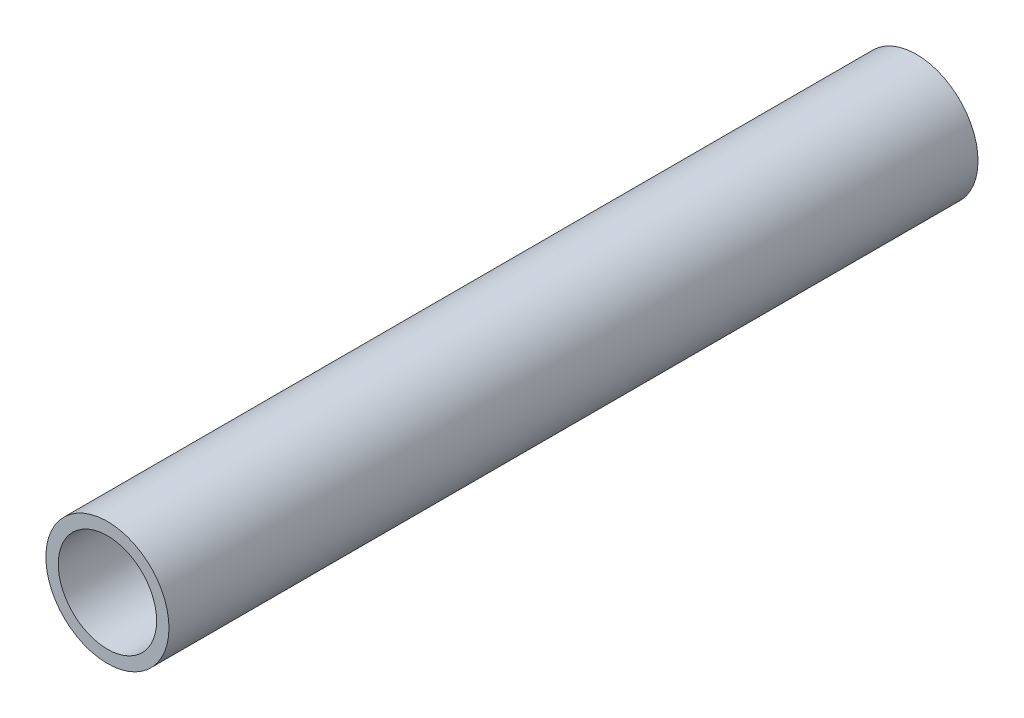
ISO-10303-21;
HEADER;
FILE_DESCRIPTION(('STEP AP214'),'2;1');
FILE_NAME('part.step','',(''),(''),'','','');
FILE_SCHEMA(('AUTOMOTIVE_DESIGN { 1 0 10303 214 1 1 1 1 }'));
ENDSEC;
DATA;
#1=APPLICATION_CONTEXT('core data for automotive mechanical design processes');
#2=APPLICATION_PROTOCOL_DEFINITION('international standard','automotive_design',2000,#1);
#3=PRODUCT_CONTEXT('',#1,'mechanical');
#4=PRODUCT('Part','Part','',(#3));
#5=PRODUCT_RELATED_PRODUCT_CATEGORY('part','',(#4));
#6=PRODUCT_DEFINITION_FORMATION('','',#4);
#7=PRODUCT_DEFINITION_CONTEXT('part definition',#1,'design');
#8=PRODUCT_DEFINITION('design','',#6,#7);
#9=PRODUCT_DEFINITION_SHAPE('','',#8);
#10=(LENGTH_UNIT() NAMED_UNIT(*) SI_UNIT(.MILLI.,.METRE.));
#11=(NAMED_UNIT(*) PLANE_ANGLE_UNIT() SI_UNIT($,.RADIAN.));
#12=(NAMED_UNIT(*) SI_UNIT($,.STERADIAN.) SOLID_ANGLE_UNIT());
#13=UNCERTAINTY_MEASURE_WITH_UNIT(LENGTH_MEASURE(1.E-05),#10,'distance_accuracy_value','');
#14=(GEOMETRIC_REPRESENTATION_CONTEXT(3) GLOBAL_UNCERTAINTY_ASSIGNED_CONTEXT((#13)) GLOBAL_UNIT_ASSIGNED_CONTEXT((#10,
#11,#12)) REPRESENTATION_CONTEXT('',''));
#15=CARTESIAN_POINT('',(0.,0.,0.));
#16=DIRECTION('',(0.,0.,1.));
#17=DIRECTION('',(1.,0.,0.));
#18=AXIS2_PLACEMENT_3D('',#15,#16,#17);
#19=CARTESIAN_POINT('',(0.,0.,140.));
#20=DIRECTION('',(0.,0.,1.));
#21=DIRECTION('',(1.,0.,0.));
#22=AXIS2_PLACEMENT_3D('',#19,#20,#21);
#23=PLANE('',#22);
#24=CARTESIAN_POINT('',(0.,0.,140.));
#25=DIRECTION('',(0.,0.,1.));
#26=DIRECTION('',(1.,0.,0.));
#27=AXIS2_PLACEMENT_3D('',#24,#25,#26);
#28=CIRCLE('',#27,10.65);
#29=CARTESIAN_POINT('',(10.65,0.,140.));
#30=VERTEX_POINT('',#29);
#31=EDGE_CURVE('E10',#30,#30,#28,.T.);
#32=ORIENTED_EDGE('',*,*,#31,.T.);
#33=EDGE_LOOP('',(#32));
#34=FACE_BOUND('',#33,.T.);
#35=CARTESIAN_POINT('',(0.,0.,140.));
#36=DIRECTION('',(0.,0.,1.));
#37=DIRECTION('',(1.,0.,0.));
#38=AXIS2_PLACEMENT_3D('',#35,#36,#37);
#39=CIRCLE('',#38,8.51);
#40=CARTESIAN_POINT('',(8.51,0.,140.));
#41=VERTEX_POINT('',#40);
#42=EDGE_CURVE('E43',#41,#41,#39,.T.);
#43=ORIENTED_EDGE('',*,*,#42,.F.);
#44=EDGE_LOOP('',(#43));
#45=FACE_BOUND('',#44,.T.);
#46=ADVANCED_FACE('F32',(#34,#45),#23,.T.);
#47=CARTESIAN_POINT('',(0.,0.,0.));
#48=DIRECTION('',(0.,0.,1.));
#49=DIRECTION('',(1.,0.,0.));
#50=AXIS2_PLACEMENT_3D('',#47,#48,#49);
#51=PLANE('',#50);
#52=CARTESIAN_POINT('',(0.,0.,0.));
#53=DIRECTION('',(0.,0.,1.));
#54=DIRECTION('',(1.,0.,0.));
#55=AXIS2_PLACEMENT_3D('',#52,#53,#54);
#56=CIRCLE('',#55,10.65);
#57=CARTESIAN_POINT('',(10.65,0.,0.));
#58=VERTEX_POINT('',#57);
#59=EDGE_CURVE('E36',#58,#58,#56,.T.);
#60=ORIENTED_EDGE('',*,*,#59,.F.);
#61=EDGE_LOOP('',(#60));
#62=FACE_BOUND('',#61,.T.);
#63=CARTESIAN_POINT('',(0.,0.,0.));
#64=DIRECTION('',(0.,0.,1.));
#65=DIRECTION('',(1.,0.,0.));
#66=AXIS2_PLACEMENT_3D('',#63,#64,#65);
#67=CIRCLE('',#66,8.51);
#68=CARTESIAN_POINT('',(8.51,0.,0.));
#69=VERTEX_POINT('',#68);
#70=EDGE_CURVE('E45',#69,#69,#67,.T.);
#71=ORIENTED_EDGE('',*,*,#70,.T.);
#72=EDGE_LOOP('',(#71));
#73=FACE_BOUND('',#72,.T.);
#74=ADVANCED_FACE('F55',(#62,#73),#51,.F.);
#75=CARTESIAN_POINT('',(0.,0.,140.));
#76=DIRECTION('',(0.,0.,-1.));
#77=DIRECTION('',(-1.,0.,0.));
#78=AXIS2_PLACEMENT_3D('',#75,#76,#77);
#79=CYLINDRICAL_SURFACE('',#78,10.65);
#80=ORIENTED_EDGE('',*,*,#31,.F.);
#81=EDGE_LOOP('',(#80));
#82=FACE_BOUND('',#81,.T.);
#83=ORIENTED_EDGE('',*,*,#59,.T.);
#84=EDGE_LOOP('',(#83));
#85=FACE_BOUND('',#84,.T.);
#86=ADVANCED_FACE('F34',(#82,#85),#79,.T.);
#87=CARTESIAN_POINT('',(0.,0.,140.));
#88=DIRECTION('',(0.,0.,-1.));
#89=DIRECTION('',(-1.,0.,0.));
#90=AXIS2_PLACEMENT_3D('',#87,#88,#89);
#91=CYLINDRICAL_SURFACE('',#90,8.51);
#92=ORIENTED_EDGE('',*,*,#42,.T.);
#93=EDGE_LOOP('',(#92));
#94=FACE_BOUND('',#93,.T.);
#95=ORIENTED_EDGE('',*,*,#70,.F.);
#96=EDGE_LOOP('',(#95));
#97=FACE_BOUND('',#96,.T.);
#98=ADVANCED_FACE('F51',(#94,#97),#91,.F.);
#99=CLOSED_SHELL('',(#46,#74,#86,#98));
#100=MANIFOLD_SOLID_BREP('B2',#99);
#101=ADVANCED_BREP_SHAPE_REPRESENTATION('',(#18,#100),#14);
#102=SHAPE_DEFINITION_REPRESENTATION(#9,#101);
ENDSEC;
END-ISO-10303-21;
